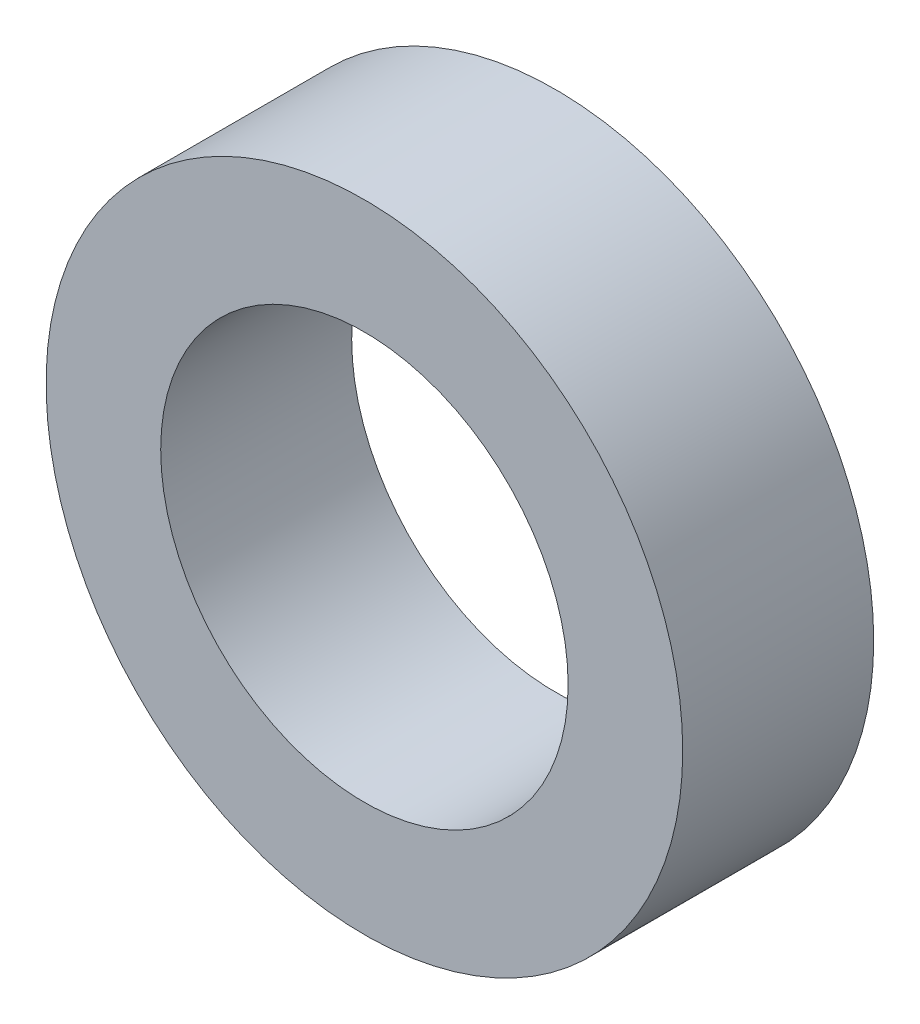
ISO-10303-21;
HEADER;
FILE_DESCRIPTION(('STEP AP214'),'2;1');
FILE_NAME('part.step','',(''),(''),'','','');
FILE_SCHEMA(('AUTOMOTIVE_DESIGN { 1 0 10303 214 1 1 1 1 }'));
ENDSEC;
DATA;
#1=APPLICATION_CONTEXT('core data for automotive mechanical design processes');
#2=APPLICATION_PROTOCOL_DEFINITION('international standard','automotive_design',2000,#1);
#3=PRODUCT_CONTEXT('',#1,'mechanical');
#4=PRODUCT('Part','Part','',(#3));
#5=PRODUCT_RELATED_PRODUCT_CATEGORY('part','',(#4));
#6=PRODUCT_DEFINITION_FORMATION('','',#4);
#7=PRODUCT_DEFINITION_CONTEXT('part definition',#1,'design');
#8=PRODUCT_DEFINITION('design','',#6,#7);
#9=PRODUCT_DEFINITION_SHAPE('','',#8);
#10=(LENGTH_UNIT() NAMED_UNIT(*) SI_UNIT(.MILLI.,.METRE.));
#11=(NAMED_UNIT(*) PLANE_ANGLE_UNIT() SI_UNIT($,.RADIAN.));
#12=(NAMED_UNIT(*) SI_UNIT($,.STERADIAN.) SOLID_ANGLE_UNIT());
#13=UNCERTAINTY_MEASURE_WITH_UNIT(LENGTH_MEASURE(1.E-05),#10,'distance_accuracy_value','');
#14=(GEOMETRIC_REPRESENTATION_CONTEXT(3) GLOBAL_UNCERTAINTY_ASSIGNED_CONTEXT((#13)) GLOBAL_UNIT_ASSIGNED_CONTEXT((#10,
#11,#12)) REPRESENTATION_CONTEXT('',''));
#15=CARTESIAN_POINT('',(0.,0.,0.));
#16=DIRECTION('',(0.,0.,1.));
#17=DIRECTION('',(1.,0.,0.));
#18=AXIS2_PLACEMENT_3D('',#15,#16,#17);
#19=CARTESIAN_POINT('',(35.708348754,-12.,12.5));
#20=DIRECTION('',(0.,0.,-1.));
#21=DIRECTION('',(-1.,0.,0.));
#22=AXIS2_PLACEMENT_3D('',#19,#20,#21);
#23=CYLINDRICAL_SURFACE('',#22,2.5);
#24=CARTESIAN_POINT('',(35.708348754,-12.,12.5));
#25=DIRECTION('',(0.,0.,1.));
#26=DIRECTION('',(1.,0.,0.));
#27=AXIS2_PLACEMENT_3D('',#24,#25,#26);
#28=CIRCLE('',#27,2.5);
#29=CARTESIAN_POINT('',(38.208348754,-12.,12.5));
#30=VERTEX_POINT('',#29);
#31=EDGE_CURVE('E10',#30,#30,#28,.T.);
#32=ORIENTED_EDGE('',*,*,#31,.F.);
#33=EDGE_LOOP('',(#32));
#34=FACE_BOUND('',#33,.T.);
#35=CARTESIAN_POINT('',(35.708348754,-12.,11.));
#36=DIRECTION('',(0.,0.,1.));
#37=DIRECTION('',(1.,0.,0.));
#38=AXIS2_PLACEMENT_3D('',#35,#36,#37);
#39=CIRCLE('',#38,2.5);
#40=CARTESIAN_POINT('',(38.208348754,-12.,11.));
#41=VERTEX_POINT('',#40);
#42=EDGE_CURVE('E46',#41,#41,#39,.T.);
#43=ORIENTED_EDGE('',*,*,#42,.T.);
#44=EDGE_LOOP('',(#43));
#45=FACE_BOUND('',#44,.T.);
#46=ADVANCED_FACE('F39',(#34,#45),#23,.T.);
#47=CARTESIAN_POINT('',(35.708348754,-12.,12.5));
#48=DIRECTION('',(0.,0.,1.));
#49=DIRECTION('',(1.,0.,0.));
#50=AXIS2_PLACEMENT_3D('',#47,#48,#49);
#51=PLANE('',#50);
#52=CARTESIAN_POINT('',(35.708348754,-12.,12.5));
#53=DIRECTION('',(0.,0.,1.));
#54=DIRECTION('',(1.,0.,0.));
#55=AXIS2_PLACEMENT_3D('',#52,#53,#54);
#56=CIRCLE('',#55,1.6);
#57=CARTESIAN_POINT('',(37.308348754,-12.,12.5));
#58=VERTEX_POINT('',#57);
#59=EDGE_CURVE('E51',#58,#58,#56,.F.);
#60=ORIENTED_EDGE('',*,*,#59,.T.);
#61=EDGE_LOOP('',(#60));
#62=FACE_BOUND('',#61,.T.);
#63=ORIENTED_EDGE('',*,*,#31,.T.);
#64=EDGE_LOOP('',(#63));
#65=FACE_BOUND('',#64,.T.);
#66=ADVANCED_FACE('F63',(#62,#65),#51,.T.);
#67=CARTESIAN_POINT('',(35.708348754,-12.,11.));
#68=DIRECTION('',(0.,0.,1.));
#69=DIRECTION('',(1.,0.,0.));
#70=AXIS2_PLACEMENT_3D('',#67,#68,#69);
#71=PLANE('',#70);
#72=CARTESIAN_POINT('',(35.708348754,-12.,11.));
#73=DIRECTION('',(0.,0.,1.));
#74=DIRECTION('',(1.,0.,0.));
#75=AXIS2_PLACEMENT_3D('',#72,#73,#74);
#76=CIRCLE('',#75,1.6);
#77=CARTESIAN_POINT('',(37.308348754,-12.,11.));
#78=VERTEX_POINT('',#77);
#79=EDGE_CURVE('E45',#78,#78,#76,.F.);
#80=ORIENTED_EDGE('',*,*,#79,.F.);
#81=EDGE_LOOP('',(#80));
#82=FACE_BOUND('',#81,.T.);
#83=ORIENTED_EDGE('',*,*,#42,.F.);
#84=EDGE_LOOP('',(#83));
#85=FACE_BOUND('',#84,.T.);
#86=ADVANCED_FACE('F61',(#82,#85),#71,.F.);
#87=CARTESIAN_POINT('',(35.708348754,-12.,12.6));
#88=DIRECTION('',(0.,0.,-1.));
#89=DIRECTION('',(-1.,0.,0.));
#90=AXIS2_PLACEMENT_3D('',#87,#88,#89);
#91=CYLINDRICAL_SURFACE('',#90,1.6);
#92=ORIENTED_EDGE('',*,*,#59,.F.);
#93=EDGE_LOOP('',(#92));
#94=FACE_BOUND('',#93,.T.);
#95=ORIENTED_EDGE('',*,*,#79,.T.);
#96=EDGE_LOOP('',(#95));
#97=FACE_BOUND('',#96,.T.);
#98=ADVANCED_FACE('F56',(#94,#97),#91,.F.);
#99=CLOSED_SHELL('',(#46,#66,#86,#98));
#100=MANIFOLD_SOLID_BREP('B2',#99);
#101=ADVANCED_BREP_SHAPE_REPRESENTATION('',(#18,#100),#14);
#102=SHAPE_DEFINITION_REPRESENTATION(#9,#101);
ENDSEC;
END-ISO-10303-21;
